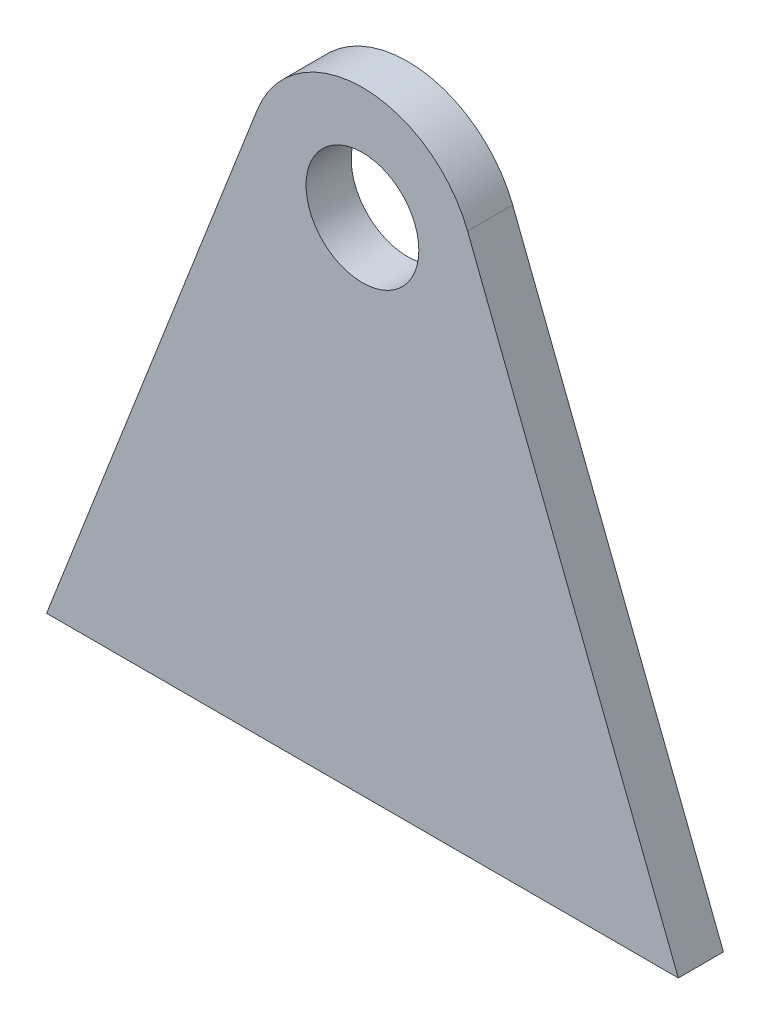
ISO-10303-21;
HEADER;
FILE_DESCRIPTION(('STEP AP214'),'2;1');
FILE_NAME('part.step','',(''),(''),'','','');
FILE_SCHEMA(('AUTOMOTIVE_DESIGN { 1 0 10303 214 1 1 1 1 }'));
ENDSEC;
DATA;
#1=APPLICATION_CONTEXT('core data for automotive mechanical design processes');
#2=APPLICATION_PROTOCOL_DEFINITION('international standard','automotive_design',2000,#1);
#3=PRODUCT_CONTEXT('',#1,'mechanical');
#4=PRODUCT('Part','Part','',(#3));
#5=PRODUCT_RELATED_PRODUCT_CATEGORY('part','',(#4));
#6=PRODUCT_DEFINITION_FORMATION('','',#4);
#7=PRODUCT_DEFINITION_CONTEXT('part definition',#1,'design');
#8=PRODUCT_DEFINITION('design','',#6,#7);
#9=PRODUCT_DEFINITION_SHAPE('','',#8);
#10=(LENGTH_UNIT() NAMED_UNIT(*) SI_UNIT(.MILLI.,.METRE.));
#11=(NAMED_UNIT(*) PLANE_ANGLE_UNIT() SI_UNIT($,.RADIAN.));
#12=(NAMED_UNIT(*) SI_UNIT($,.STERADIAN.) SOLID_ANGLE_UNIT());
#13=UNCERTAINTY_MEASURE_WITH_UNIT(LENGTH_MEASURE(1.E-05),#10,'distance_accuracy_value','');
#14=(GEOMETRIC_REPRESENTATION_CONTEXT(3) GLOBAL_UNCERTAINTY_ASSIGNED_CONTEXT((#13)) GLOBAL_UNIT_ASSIGNED_CONTEXT((#10,
#11,#12)) REPRESENTATION_CONTEXT('',''));
#15=CARTESIAN_POINT('',(0.,0.,0.));
#16=DIRECTION('',(0.,0.,1.));
#17=DIRECTION('',(1.,0.,0.));
#18=AXIS2_PLACEMENT_3D('',#15,#16,#17);
#19=CARTESIAN_POINT('',(140.,221.865697419371,20.));
#20=DIRECTION('',(0.,0.,1.));
#21=DIRECTION('',(1.,0.,0.));
#22=AXIS2_PLACEMENT_3D('',#19,#20,#21);
#23=PLANE('',#22);
#24=DIRECTION('',(1.,0.,0.));
#25=VECTOR('',#24,1.);
#26=CARTESIAN_POINT('',(0.,0.,20.));
#27=LINE('',#26,#25);
#28=CARTESIAN_POINT('',(0.,0.,20.));
#29=VERTEX_POINT('',#28);
#30=CARTESIAN_POINT('',(280.,0.,20.));
#31=VERTEX_POINT('',#30);
#32=EDGE_CURVE('E98',#29,#31,#27,.T.);
#33=ORIENTED_EDGE('',*,*,#32,.T.);
#34=DIRECTION('',(-0.362686051612586,0.931911384180745,0.));
#35=VECTOR('',#34,1.);
#36=CARTESIAN_POINT('',(280.,0.,20.));
#37=LINE('',#36,#35);
#38=CARTESIAN_POINT('',(186.595569209037,240.,20.));
#39=VERTEX_POINT('',#38);
#40=EDGE_CURVE('E91',#31,#39,#37,.T.);
#41=ORIENTED_EDGE('',*,*,#40,.T.);
#42=CARTESIAN_POINT('',(140.,221.865697419371,20.));
#43=DIRECTION('',(0.,0.,1.));
#44=DIRECTION('',(1.,0.,0.));
#45=AXIS2_PLACEMENT_3D('',#42,#43,#44);
#46=CIRCLE('',#45,50.);
#47=CARTESIAN_POINT('',(93.4044307909627,240.,20.));
#48=VERTEX_POINT('',#47);
#49=EDGE_CURVE('E97',#39,#48,#46,.T.);
#50=ORIENTED_EDGE('',*,*,#49,.T.);
#51=DIRECTION('',(0.362686051612586,0.931911384180745,0.));
#52=VECTOR('',#51,1.);
#53=CARTESIAN_POINT('',(0.,0.,20.));
#54=LINE('',#53,#52);
#55=EDGE_CURVE('E107',#29,#48,#54,.T.);
#56=ORIENTED_EDGE('',*,*,#55,.F.);
#57=EDGE_LOOP('',(#33,#41,#50,#56));
#58=FACE_BOUND('',#57,.T.);
#59=CARTESIAN_POINT('',(140.,221.865697419371,20.));
#60=DIRECTION('',(0.,0.,1.));
#61=DIRECTION('',(1.,0.,0.));
#62=AXIS2_PLACEMENT_3D('',#59,#60,#61);
#63=CIRCLE('',#62,25.);
#64=CARTESIAN_POINT('',(165.,221.865697419371,20.));
#65=VERTEX_POINT('',#64);
#66=EDGE_CURVE('E114',#65,#65,#63,.T.);
#67=ORIENTED_EDGE('',*,*,#66,.F.);
#68=EDGE_LOOP('',(#67));
#69=FACE_BOUND('',#68,.T.);
#70=ADVANCED_FACE('F48',(#58,#69),#23,.T.);
#71=CARTESIAN_POINT('',(140.,221.865697419371,0.));
#72=DIRECTION('',(0.,0.,1.));
#73=DIRECTION('',(1.,0.,0.));
#74=AXIS2_PLACEMENT_3D('',#71,#72,#73);
#75=PLANE('',#74);
#76=DIRECTION('',(1.,0.,0.));
#77=VECTOR('',#76,1.);
#78=CARTESIAN_POINT('',(0.,0.,0.));
#79=LINE('',#78,#77);
#80=CARTESIAN_POINT('',(0.,0.,0.));
#81=VERTEX_POINT('',#80);
#82=CARTESIAN_POINT('',(280.,0.,0.));
#83=VERTEX_POINT('',#82);
#84=EDGE_CURVE('E112',#81,#83,#79,.T.);
#85=ORIENTED_EDGE('',*,*,#84,.F.);
#86=DIRECTION('',(0.362686051612586,0.931911384180745,0.));
#87=VECTOR('',#86,1.);
#88=CARTESIAN_POINT('',(0.,0.,0.));
#89=LINE('',#88,#87);
#90=CARTESIAN_POINT('',(93.4044307909627,240.,0.));
#91=VERTEX_POINT('',#90);
#92=EDGE_CURVE('E118',#81,#91,#89,.T.);
#93=ORIENTED_EDGE('',*,*,#92,.T.);
#94=CARTESIAN_POINT('',(140.,221.865697419371,0.));
#95=DIRECTION('',(0.,0.,1.));
#96=DIRECTION('',(1.,0.,0.));
#97=AXIS2_PLACEMENT_3D('',#94,#95,#96);
#98=CIRCLE('',#97,50.);
#99=CARTESIAN_POINT('',(186.595569209037,240.,0.));
#100=VERTEX_POINT('',#99);
#101=EDGE_CURVE('E116',#100,#91,#98,.T.);
#102=ORIENTED_EDGE('',*,*,#101,.F.);
#103=DIRECTION('',(-0.362686051612586,0.931911384180745,0.));
#104=VECTOR('',#103,1.);
#105=CARTESIAN_POINT('',(280.,0.,0.));
#106=LINE('',#105,#104);
#107=EDGE_CURVE('E103',#83,#100,#106,.T.);
#108=ORIENTED_EDGE('',*,*,#107,.F.);
#109=EDGE_LOOP('',(#85,#93,#102,#108));
#110=FACE_BOUND('',#109,.T.);
#111=CARTESIAN_POINT('',(140.,221.865697419371,0.));
#112=DIRECTION('',(0.,0.,1.));
#113=DIRECTION('',(1.,0.,0.));
#114=AXIS2_PLACEMENT_3D('',#111,#112,#113);
#115=CIRCLE('',#114,25.);
#116=CARTESIAN_POINT('',(165.,221.865697419371,0.));
#117=VERTEX_POINT('',#116);
#118=EDGE_CURVE('E124',#117,#117,#115,.T.);
#119=ORIENTED_EDGE('',*,*,#118,.T.);
#120=EDGE_LOOP('',(#119));
#121=FACE_BOUND('',#120,.T.);
#122=ADVANCED_FACE('F133',(#110,#121),#75,.F.);
#123=CARTESIAN_POINT('',(0.,0.,20.));
#124=DIRECTION('',(0.,1.,0.));
#125=DIRECTION('',(0.,0.,1.));
#126=AXIS2_PLACEMENT_3D('',#123,#124,#125);
#127=PLANE('',#126);
#128=ORIENTED_EDGE('',*,*,#84,.T.);
#129=DIRECTION('',(0.,0.,-1.));
#130=VECTOR('',#129,1.);
#131=CARTESIAN_POINT('',(280.,0.,20.));
#132=LINE('',#131,#130);
#133=EDGE_CURVE('E12',#31,#83,#132,.T.);
#134=ORIENTED_EDGE('',*,*,#133,.F.);
#135=ORIENTED_EDGE('',*,*,#32,.F.);
#136=DIRECTION('',(0.,0.,-1.));
#137=VECTOR('',#136,1.);
#138=CARTESIAN_POINT('',(0.,0.,20.));
#139=LINE('',#138,#137);
#140=EDGE_CURVE('E65',#29,#81,#139,.T.);
#141=ORIENTED_EDGE('',*,*,#140,.T.);
#142=EDGE_LOOP('',(#128,#134,#135,#141));
#143=FACE_BOUND('',#142,.T.);
#144=ADVANCED_FACE('F50',(#143),#127,.F.);
#145=CARTESIAN_POINT('',(280.,0.,20.));
#146=DIRECTION('',(-0.931911384180745,-0.362686051612586,0.));
#147=DIRECTION('',(0.362686051612586,-0.931911384180745,0.));
#148=AXIS2_PLACEMENT_3D('',#145,#146,#147);
#149=PLANE('',#148);
#150=ORIENTED_EDGE('',*,*,#107,.T.);
#151=DIRECTION('',(0.,0.,-1.));
#152=VECTOR('',#151,1.);
#153=CARTESIAN_POINT('',(186.595569209037,240.,20.));
#154=LINE('',#153,#152);
#155=EDGE_CURVE('E57',#39,#100,#154,.T.);
#156=ORIENTED_EDGE('',*,*,#155,.F.);
#157=ORIENTED_EDGE('',*,*,#40,.F.);
#158=ORIENTED_EDGE('',*,*,#133,.T.);
#159=EDGE_LOOP('',(#150,#156,#157,#158));
#160=FACE_BOUND('',#159,.T.);
#161=ADVANCED_FACE('F102',(#160),#149,.F.);
#162=CARTESIAN_POINT('',(140.,221.865697419371,20.));
#163=DIRECTION('',(0.,0.,-1.));
#164=DIRECTION('',(-1.,0.,0.));
#165=AXIS2_PLACEMENT_3D('',#162,#163,#164);
#166=CYLINDRICAL_SURFACE('',#165,50.);
#167=ORIENTED_EDGE('',*,*,#101,.T.);
#168=DIRECTION('',(0.,0.,-1.));
#169=VECTOR('',#168,1.);
#170=CARTESIAN_POINT('',(93.4044307909627,240.,20.));
#171=LINE('',#170,#169);
#172=EDGE_CURVE('E80',#48,#91,#171,.T.);
#173=ORIENTED_EDGE('',*,*,#172,.F.);
#174=ORIENTED_EDGE('',*,*,#49,.F.);
#175=ORIENTED_EDGE('',*,*,#155,.T.);
#176=EDGE_LOOP('',(#167,#173,#174,#175));
#177=FACE_BOUND('',#176,.T.);
#178=ADVANCED_FACE('F106',(#177),#166,.T.);
#179=CARTESIAN_POINT('',(0.,0.,20.));
#180=DIRECTION('',(-0.931911384180745,0.362686051612586,0.));
#181=DIRECTION('',(-0.362686051612586,-0.931911384180745,0.));
#182=AXIS2_PLACEMENT_3D('',#179,#180,#181);
#183=PLANE('',#182);
#184=ORIENTED_EDGE('',*,*,#92,.F.);
#185=ORIENTED_EDGE('',*,*,#140,.F.);
#186=ORIENTED_EDGE('',*,*,#55,.T.);
#187=ORIENTED_EDGE('',*,*,#172,.T.);
#188=EDGE_LOOP('',(#184,#185,#186,#187));
#189=FACE_BOUND('',#188,.T.);
#190=ADVANCED_FACE('F141',(#189),#183,.T.);
#191=CARTESIAN_POINT('',(140.,221.865697419371,20.));
#192=DIRECTION('',(0.,0.,-1.));
#193=DIRECTION('',(-1.,0.,0.));
#194=AXIS2_PLACEMENT_3D('',#191,#192,#193);
#195=CYLINDRICAL_SURFACE('',#194,25.);
#196=ORIENTED_EDGE('',*,*,#66,.T.);
#197=EDGE_LOOP('',(#196));
#198=FACE_BOUND('',#197,.T.);
#199=ORIENTED_EDGE('',*,*,#118,.F.);
#200=EDGE_LOOP('',(#199));
#201=FACE_BOUND('',#200,.T.);
#202=ADVANCED_FACE('F130',(#198,#201),#195,.F.);
#203=CLOSED_SHELL('',(#70,#122,#144,#161,#178,#190,#202));
#204=MANIFOLD_SOLID_BREP('B2',#203);
#205=ADVANCED_BREP_SHAPE_REPRESENTATION('',(#18,#204),#14);
#206=SHAPE_DEFINITION_REPRESENTATION(#9,#205);
ENDSEC;
END-ISO-10303-21;
